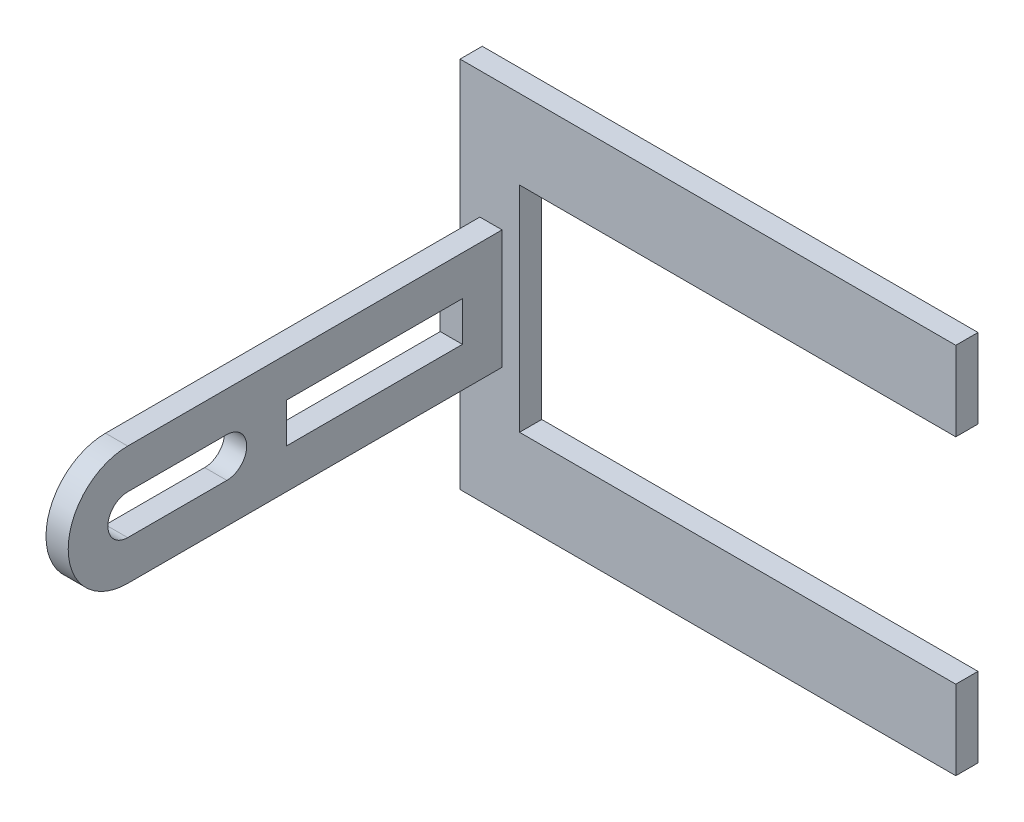
ISO-10303-21;
HEADER;
FILE_DESCRIPTION(('STEP AP214'),'2;1');
FILE_NAME('part.step','',(''),(''),'','','');
FILE_SCHEMA(('AUTOMOTIVE_DESIGN { 1 0 10303 214 1 1 1 1 }'));
ENDSEC;
DATA;
#1=APPLICATION_CONTEXT('core data for automotive mechanical design processes');
#2=APPLICATION_PROTOCOL_DEFINITION('international standard','automotive_design',2000,#1);
#3=PRODUCT_CONTEXT('',#1,'mechanical');
#4=PRODUCT('Part','Part','',(#3));
#5=PRODUCT_RELATED_PRODUCT_CATEGORY('part','',(#4));
#6=PRODUCT_DEFINITION_FORMATION('','',#4);
#7=PRODUCT_DEFINITION_CONTEXT('part definition',#1,'design');
#8=PRODUCT_DEFINITION('design','',#6,#7);
#9=PRODUCT_DEFINITION_SHAPE('','',#8);
#10=(LENGTH_UNIT() NAMED_UNIT(*) SI_UNIT(.MILLI.,.METRE.));
#11=(NAMED_UNIT(*) PLANE_ANGLE_UNIT() SI_UNIT($,.RADIAN.));
#12=(NAMED_UNIT(*) SI_UNIT($,.STERADIAN.) SOLID_ANGLE_UNIT());
#13=UNCERTAINTY_MEASURE_WITH_UNIT(LENGTH_MEASURE(1.E-05),#10,'distance_accuracy_value','');
#14=(GEOMETRIC_REPRESENTATION_CONTEXT(3) GLOBAL_UNCERTAINTY_ASSIGNED_CONTEXT((#13)) GLOBAL_UNIT_ASSIGNED_CONTEXT((#10,
#11,#12)) REPRESENTATION_CONTEXT('',''));
#15=CARTESIAN_POINT('',(0.,0.,0.));
#16=DIRECTION('',(0.,0.,1.));
#17=DIRECTION('',(1.,0.,0.));
#18=AXIS2_PLACEMENT_3D('',#15,#16,#17);
#19=CARTESIAN_POINT('',(0.,0.,2.8));
#20=DIRECTION('',(0.,0.,1.));
#21=DIRECTION('',(1.,0.,0.));
#22=AXIS2_PLACEMENT_3D('',#19,#20,#21);
#23=PLANE('',#22);
#24=DIRECTION('',(1.,0.,0.));
#25=VECTOR('',#24,1.);
#26=CARTESIAN_POINT('',(-25.,13.5,2.8));
#27=LINE('',#26,#25);
#28=CARTESIAN_POINT('',(-25.,13.5,2.8));
#29=VERTEX_POINT('',#28);
#30=CARTESIAN_POINT('',(30.,13.5,2.8));
#31=VERTEX_POINT('',#30);
#32=EDGE_CURVE('E157',#29,#31,#27,.T.);
#33=ORIENTED_EDGE('',*,*,#32,.T.);
#34=DIRECTION('',(0.,1.,0.));
#35=VECTOR('',#34,1.);
#36=CARTESIAN_POINT('',(30.,13.5,2.8));
#37=LINE('',#36,#35);
#38=CARTESIAN_POINT('',(30.,23.5,2.8));
#39=VERTEX_POINT('',#38);
#40=EDGE_CURVE('E98',#31,#39,#37,.T.);
#41=ORIENTED_EDGE('',*,*,#40,.T.);
#42=DIRECTION('',(-1.,0.,0.));
#43=VECTOR('',#42,1.);
#44=CARTESIAN_POINT('',(30.,23.5,2.8));
#45=LINE('',#44,#43);
#46=CARTESIAN_POINT('',(-32.5,23.5,2.8));
#47=VERTEX_POINT('',#46);
#48=EDGE_CURVE('E172',#39,#47,#45,.T.);
#49=ORIENTED_EDGE('',*,*,#48,.T.);
#50=DIRECTION('',(0.,-1.,0.));
#51=VECTOR('',#50,1.);
#52=CARTESIAN_POINT('',(-32.5,23.5,2.8));
#53=LINE('',#52,#51);
#54=CARTESIAN_POINT('',(-32.5,-23.5,2.8));
#55=VERTEX_POINT('',#54);
#56=EDGE_CURVE('E184',#47,#55,#53,.T.);
#57=ORIENTED_EDGE('',*,*,#56,.T.);
#58=DIRECTION('',(1.,0.,0.));
#59=VECTOR('',#58,1.);
#60=CARTESIAN_POINT('',(-32.5,-23.5,2.8));
#61=LINE('',#60,#59);
#62=CARTESIAN_POINT('',(30.,-23.5,2.8));
#63=VERTEX_POINT('',#62);
#64=EDGE_CURVE('E120',#55,#63,#61,.T.);
#65=ORIENTED_EDGE('',*,*,#64,.T.);
#66=DIRECTION('',(0.,1.,0.));
#67=VECTOR('',#66,1.);
#68=CARTESIAN_POINT('',(30.,-23.5,2.8));
#69=LINE('',#68,#67);
#70=CARTESIAN_POINT('',(30.,-13.5,2.8));
#71=VERTEX_POINT('',#70);
#72=EDGE_CURVE('E113',#63,#71,#69,.T.);
#73=ORIENTED_EDGE('',*,*,#72,.T.);
#74=DIRECTION('',(-1.,0.,0.));
#75=VECTOR('',#74,1.);
#76=CARTESIAN_POINT('',(30.,-13.5,2.8));
#77=LINE('',#76,#75);
#78=CARTESIAN_POINT('',(-25.,-13.5,2.8));
#79=VERTEX_POINT('',#78);
#80=EDGE_CURVE('E117',#71,#79,#77,.T.);
#81=ORIENTED_EDGE('',*,*,#80,.T.);
#82=DIRECTION('',(0.,1.,0.));
#83=VECTOR('',#82,1.);
#84=CARTESIAN_POINT('',(-25.,-13.5,2.8));
#85=LINE('',#84,#83);
#86=EDGE_CURVE('E57',#79,#29,#85,.T.);
#87=ORIENTED_EDGE('',*,*,#86,.T.);
#88=EDGE_LOOP('',(#33,#41,#49,#57,#65,#73,#81,#87));
#89=FACE_BOUND('',#88,.T.);
#90=DIRECTION('',(0.,1.,0.));
#91=VECTOR('',#90,1.);
#92=CARTESIAN_POINT('',(-27.2,-7.5,2.8));
#93=LINE('',#92,#91);
#94=CARTESIAN_POINT('',(-27.2,-7.5,2.8));
#95=VERTEX_POINT('',#94);
#96=CARTESIAN_POINT('',(-27.2,7.5,2.8));
#97=VERTEX_POINT('',#96);
#98=EDGE_CURVE('E218',#95,#97,#93,.T.);
#99=ORIENTED_EDGE('',*,*,#98,.F.);
#100=DIRECTION('',(-1.,0.,0.));
#101=VECTOR('',#100,1.);
#102=CARTESIAN_POINT('',(-27.2,-7.5,2.8));
#103=LINE('',#102,#101);
#104=CARTESIAN_POINT('',(-30.,-7.5,2.8));
#105=VERTEX_POINT('',#104);
#106=EDGE_CURVE('E145',#95,#105,#103,.T.);
#107=ORIENTED_EDGE('',*,*,#106,.T.);
#108=DIRECTION('',(0.,1.,0.));
#109=VECTOR('',#108,1.);
#110=CARTESIAN_POINT('',(-30.,-7.5,2.8));
#111=LINE('',#110,#109);
#112=CARTESIAN_POINT('',(-30.,7.5,2.8));
#113=VERTEX_POINT('',#112);
#114=EDGE_CURVE('E208',#105,#113,#111,.T.);
#115=ORIENTED_EDGE('',*,*,#114,.T.);
#116=DIRECTION('',(-1.,0.,0.));
#117=VECTOR('',#116,1.);
#118=CARTESIAN_POINT('',(-27.2,7.5,2.8));
#119=LINE('',#118,#117);
#120=EDGE_CURVE('E192',#97,#113,#119,.T.);
#121=ORIENTED_EDGE('',*,*,#120,.F.);
#122=EDGE_LOOP('',(#99,#107,#115,#121));
#123=FACE_BOUND('',#122,.T.);
#124=ADVANCED_FACE('F33',(#89,#123),#23,.T.);
#125=CARTESIAN_POINT('',(-25.,13.5,2.8));
#126=DIRECTION('',(0.,1.,0.));
#127=DIRECTION('',(-1.,0.,0.));
#128=AXIS2_PLACEMENT_3D('',#125,#126,#127);
#129=PLANE('',#128);
#130=DIRECTION('',(1.,0.,0.));
#131=VECTOR('',#130,1.);
#132=CARTESIAN_POINT('',(-25.,13.5,0.));
#133=LINE('',#132,#131);
#134=CARTESIAN_POINT('',(-25.,13.5,0.));
#135=VERTEX_POINT('',#134);
#136=CARTESIAN_POINT('',(30.,13.5,0.));
#137=VERTEX_POINT('',#136);
#138=EDGE_CURVE('E141',#135,#137,#133,.T.);
#139=ORIENTED_EDGE('',*,*,#138,.T.);
#140=DIRECTION('',(0.,0.,-1.));
#141=VECTOR('',#140,1.);
#142=CARTESIAN_POINT('',(30.,13.5,2.8));
#143=LINE('',#142,#141);
#144=EDGE_CURVE('E11',#31,#137,#143,.T.);
#145=ORIENTED_EDGE('',*,*,#144,.F.);
#146=ORIENTED_EDGE('',*,*,#32,.F.);
#147=DIRECTION('',(0.,0.,-1.));
#148=VECTOR('',#147,1.);
#149=CARTESIAN_POINT('',(-25.,13.5,2.8));
#150=LINE('',#149,#148);
#151=EDGE_CURVE('E137',#29,#135,#150,.T.);
#152=ORIENTED_EDGE('',*,*,#151,.T.);
#153=EDGE_LOOP('',(#139,#145,#146,#152));
#154=FACE_BOUND('',#153,.T.);
#155=ADVANCED_FACE('F35',(#154),#129,.F.);
#156=CARTESIAN_POINT('',(30.,13.5,2.8));
#157=DIRECTION('',(-1.,0.,0.));
#158=DIRECTION('',(0.,-1.,0.));
#159=AXIS2_PLACEMENT_3D('',#156,#157,#158);
#160=PLANE('',#159);
#161=DIRECTION('',(0.,1.,0.));
#162=VECTOR('',#161,1.);
#163=CARTESIAN_POINT('',(30.,13.5,0.));
#164=LINE('',#163,#162);
#165=CARTESIAN_POINT('',(30.,23.5,0.));
#166=VERTEX_POINT('',#165);
#167=EDGE_CURVE('E144',#137,#166,#164,.T.);
#168=ORIENTED_EDGE('',*,*,#167,.T.);
#169=DIRECTION('',(0.,0.,-1.));
#170=VECTOR('',#169,1.);
#171=CARTESIAN_POINT('',(30.,23.5,2.8));
#172=LINE('',#171,#170);
#173=EDGE_CURVE('E41',#39,#166,#172,.T.);
#174=ORIENTED_EDGE('',*,*,#173,.F.);
#175=ORIENTED_EDGE('',*,*,#40,.F.);
#176=ORIENTED_EDGE('',*,*,#144,.T.);
#177=EDGE_LOOP('',(#168,#174,#175,#176));
#178=FACE_BOUND('',#177,.T.);
#179=ADVANCED_FACE('F383',(#178),#160,.F.);
#180=CARTESIAN_POINT('',(30.,23.5,2.8));
#181=DIRECTION('',(0.,-1.,0.));
#182=DIRECTION('',(1.,0.,0.));
#183=AXIS2_PLACEMENT_3D('',#180,#181,#182);
#184=PLANE('',#183);
#185=DIRECTION('',(-1.,0.,0.));
#186=VECTOR('',#185,1.);
#187=CARTESIAN_POINT('',(30.,23.5,0.));
#188=LINE('',#187,#186);
#189=CARTESIAN_POINT('',(-32.5,23.5,0.));
#190=VERTEX_POINT('',#189);
#191=EDGE_CURVE('E147',#166,#190,#188,.T.);
#192=ORIENTED_EDGE('',*,*,#191,.T.);
#193=DIRECTION('',(0.,0.,-1.));
#194=VECTOR('',#193,1.);
#195=CARTESIAN_POINT('',(-32.5,23.5,2.8));
#196=LINE('',#195,#194);
#197=EDGE_CURVE('E164',#47,#190,#196,.T.);
#198=ORIENTED_EDGE('',*,*,#197,.F.);
#199=ORIENTED_EDGE('',*,*,#48,.F.);
#200=ORIENTED_EDGE('',*,*,#173,.T.);
#201=EDGE_LOOP('',(#192,#198,#199,#200));
#202=FACE_BOUND('',#201,.T.);
#203=ADVANCED_FACE('F170',(#202),#184,.F.);
#204=CARTESIAN_POINT('',(-32.5,23.5,2.8));
#205=DIRECTION('',(1.,0.,0.));
#206=DIRECTION('',(0.,1.,0.));
#207=AXIS2_PLACEMENT_3D('',#204,#205,#206);
#208=PLANE('',#207);
#209=DIRECTION('',(0.,-1.,0.));
#210=VECTOR('',#209,1.);
#211=CARTESIAN_POINT('',(-32.5,23.5,0.));
#212=LINE('',#211,#210);
#213=CARTESIAN_POINT('',(-32.5,-23.5,0.));
#214=VERTEX_POINT('',#213);
#215=EDGE_CURVE('E149',#190,#214,#212,.T.);
#216=ORIENTED_EDGE('',*,*,#215,.T.);
#217=DIRECTION('',(0.,0.,-1.));
#218=VECTOR('',#217,1.);
#219=CARTESIAN_POINT('',(-32.5,-23.5,2.8));
#220=LINE('',#219,#218);
#221=EDGE_CURVE('E161',#55,#214,#220,.T.);
#222=ORIENTED_EDGE('',*,*,#221,.F.);
#223=ORIENTED_EDGE('',*,*,#56,.F.);
#224=ORIENTED_EDGE('',*,*,#197,.T.);
#225=EDGE_LOOP('',(#216,#222,#223,#224));
#226=FACE_BOUND('',#225,.T.);
#227=ADVANCED_FACE('F180',(#226),#208,.F.);
#228=CARTESIAN_POINT('',(-32.5,-23.5,2.8));
#229=DIRECTION('',(0.,1.,0.));
#230=DIRECTION('',(0.,0.,1.));
#231=AXIS2_PLACEMENT_3D('',#228,#229,#230);
#232=PLANE('',#231);
#233=DIRECTION('',(1.,0.,0.));
#234=VECTOR('',#233,1.);
#235=CARTESIAN_POINT('',(-32.5,-23.5,0.));
#236=LINE('',#235,#234);
#237=CARTESIAN_POINT('',(30.,-23.5,0.));
#238=VERTEX_POINT('',#237);
#239=EDGE_CURVE('E151',#214,#238,#236,.T.);
#240=ORIENTED_EDGE('',*,*,#239,.T.);
#241=DIRECTION('',(0.,0.,-1.));
#242=VECTOR('',#241,1.);
#243=CARTESIAN_POINT('',(30.,-23.5,2.8));
#244=LINE('',#243,#242);
#245=EDGE_CURVE('E132',#63,#238,#244,.T.);
#246=ORIENTED_EDGE('',*,*,#245,.F.);
#247=ORIENTED_EDGE('',*,*,#64,.F.);
#248=ORIENTED_EDGE('',*,*,#221,.T.);
#249=EDGE_LOOP('',(#240,#246,#247,#248));
#250=FACE_BOUND('',#249,.T.);
#251=ADVANCED_FACE('F183',(#250),#232,.F.);
#252=CARTESIAN_POINT('',(30.,-23.5,2.8));
#253=DIRECTION('',(-1.,0.,0.));
#254=DIRECTION('',(0.,0.,1.));
#255=AXIS2_PLACEMENT_3D('',#252,#253,#254);
#256=PLANE('',#255);
#257=DIRECTION('',(0.,1.,0.));
#258=VECTOR('',#257,1.);
#259=CARTESIAN_POINT('',(30.,-23.5,0.));
#260=LINE('',#259,#258);
#261=CARTESIAN_POINT('',(30.,-13.5,0.));
#262=VERTEX_POINT('',#261);
#263=EDGE_CURVE('E129',#238,#262,#260,.T.);
#264=ORIENTED_EDGE('',*,*,#263,.T.);
#265=DIRECTION('',(0.,0.,-1.));
#266=VECTOR('',#265,1.);
#267=CARTESIAN_POINT('',(30.,-13.5,2.8));
#268=LINE('',#267,#266);
#269=EDGE_CURVE('E126',#71,#262,#268,.T.);
#270=ORIENTED_EDGE('',*,*,#269,.F.);
#271=ORIENTED_EDGE('',*,*,#72,.F.);
#272=ORIENTED_EDGE('',*,*,#245,.T.);
#273=EDGE_LOOP('',(#264,#270,#271,#272));
#274=FACE_BOUND('',#273,.T.);
#275=ADVANCED_FACE('F127',(#274),#256,.F.);
#276=CARTESIAN_POINT('',(30.,-13.5,2.8));
#277=DIRECTION('',(0.,-1.,0.));
#278=DIRECTION('',(1.,0.,0.));
#279=AXIS2_PLACEMENT_3D('',#276,#277,#278);
#280=PLANE('',#279);
#281=DIRECTION('',(-1.,0.,0.));
#282=VECTOR('',#281,1.);
#283=CARTESIAN_POINT('',(30.,-13.5,0.));
#284=LINE('',#283,#282);
#285=CARTESIAN_POINT('',(-25.,-13.5,0.));
#286=VERTEX_POINT('',#285);
#287=EDGE_CURVE('E154',#262,#286,#284,.T.);
#288=ORIENTED_EDGE('',*,*,#287,.T.);
#289=DIRECTION('',(0.,0.,-1.));
#290=VECTOR('',#289,1.);
#291=CARTESIAN_POINT('',(-25.,-13.5,2.8));
#292=LINE('',#291,#290);
#293=EDGE_CURVE('E133',#79,#286,#292,.T.);
#294=ORIENTED_EDGE('',*,*,#293,.F.);
#295=ORIENTED_EDGE('',*,*,#80,.F.);
#296=ORIENTED_EDGE('',*,*,#269,.T.);
#297=EDGE_LOOP('',(#288,#294,#295,#296));
#298=FACE_BOUND('',#297,.T.);
#299=ADVANCED_FACE('F135',(#298),#280,.F.);
#300=CARTESIAN_POINT('',(-25.,-13.5,2.8));
#301=DIRECTION('',(-1.,0.,0.));
#302=DIRECTION('',(0.,0.,1.));
#303=AXIS2_PLACEMENT_3D('',#300,#301,#302);
#304=PLANE('',#303);
#305=DIRECTION('',(0.,1.,0.));
#306=VECTOR('',#305,1.);
#307=CARTESIAN_POINT('',(-25.,-13.5,0.));
#308=LINE('',#307,#306);
#309=EDGE_CURVE('E90',#286,#135,#308,.T.);
#310=ORIENTED_EDGE('',*,*,#309,.T.);
#311=ORIENTED_EDGE('',*,*,#151,.F.);
#312=ORIENTED_EDGE('',*,*,#86,.F.);
#313=ORIENTED_EDGE('',*,*,#293,.T.);
#314=EDGE_LOOP('',(#310,#311,#312,#313));
#315=FACE_BOUND('',#314,.T.);
#316=ADVANCED_FACE('F389',(#315),#304,.F.);
#317=CARTESIAN_POINT('',(0.,0.,0.));
#318=DIRECTION('',(0.,0.,1.));
#319=DIRECTION('',(1.,0.,0.));
#320=AXIS2_PLACEMENT_3D('',#317,#318,#319);
#321=PLANE('',#320);
#322=ORIENTED_EDGE('',*,*,#138,.F.);
#323=ORIENTED_EDGE('',*,*,#309,.F.);
#324=ORIENTED_EDGE('',*,*,#287,.F.);
#325=ORIENTED_EDGE('',*,*,#263,.F.);
#326=ORIENTED_EDGE('',*,*,#239,.F.);
#327=ORIENTED_EDGE('',*,*,#215,.F.);
#328=ORIENTED_EDGE('',*,*,#191,.F.);
#329=ORIENTED_EDGE('',*,*,#167,.F.);
#330=EDGE_LOOP('',(#322,#323,#324,#325,#326,#327,#328,#329));
#331=FACE_BOUND('',#330,.T.);
#332=ADVANCED_FACE('F176',(#331),#321,.F.);
#333=CARTESIAN_POINT('',(-27.2,0.,50.));
#334=DIRECTION('',(1.,0.,0.));
#335=DIRECTION('',(0.,0.,-1.));
#336=AXIS2_PLACEMENT_3D('',#333,#334,#335);
#337=PLANE('',#336);
#338=DIRECTION('',(0.,0.,-1.));
#339=VECTOR('',#338,1.);
#340=CARTESIAN_POINT('',(-27.2,-7.5,50.));
#341=LINE('',#340,#339);
#342=CARTESIAN_POINT('',(-27.2,-7.5,50.));
#343=VERTEX_POINT('',#342);
#344=EDGE_CURVE('E204',#343,#95,#341,.T.);
#345=ORIENTED_EDGE('',*,*,#344,.T.);
#346=ORIENTED_EDGE('',*,*,#98,.T.);
#347=DIRECTION('',(0.,0.,1.));
#348=VECTOR('',#347,1.);
#349=CARTESIAN_POINT('',(-27.2,7.5,2.8));
#350=LINE('',#349,#348);
#351=CARTESIAN_POINT('',(-27.2,7.5,50.));
#352=VERTEX_POINT('',#351);
#353=EDGE_CURVE('E48',#97,#352,#350,.T.);
#354=ORIENTED_EDGE('',*,*,#353,.T.);
#355=CARTESIAN_POINT('',(-27.2,0.,50.));
#356=DIRECTION('',(1.,0.,0.));
#357=DIRECTION('',(0.,0.,-1.));
#358=AXIS2_PLACEMENT_3D('',#355,#356,#357);
#359=CIRCLE('',#358,7.5);
#360=EDGE_CURVE('E200',#352,#343,#359,.T.);
#361=ORIENTED_EDGE('',*,*,#360,.T.);
#362=EDGE_LOOP('',(#345,#346,#354,#361));
#363=FACE_BOUND('',#362,.T.);
#364=DIRECTION('',(0.,0.,-1.));
#365=VECTOR('',#364,1.);
#366=CARTESIAN_POINT('',(-27.2,-2.5,50.));
#367=LINE('',#366,#365);
#368=CARTESIAN_POINT('',(-27.2,-2.5,50.));
#369=VERTEX_POINT('',#368);
#370=CARTESIAN_POINT('',(-27.2,-2.5,37.5));
#371=VERTEX_POINT('',#370);
#372=EDGE_CURVE('E253',#369,#371,#367,.T.);
#373=ORIENTED_EDGE('',*,*,#372,.F.);
#374=CARTESIAN_POINT('',(-27.2,0.,50.));
#375=DIRECTION('',(1.,0.,0.));
#376=DIRECTION('',(0.,0.,-1.));
#377=AXIS2_PLACEMENT_3D('',#374,#375,#376);
#378=CIRCLE('',#377,2.5);
#379=CARTESIAN_POINT('',(-27.2,2.5,50.));
#380=VERTEX_POINT('',#379);
#381=EDGE_CURVE('E237',#380,#369,#378,.T.);
#382=ORIENTED_EDGE('',*,*,#381,.F.);
#383=DIRECTION('',(0.,0.,1.));
#384=VECTOR('',#383,1.);
#385=CARTESIAN_POINT('',(-27.2,2.5,37.5));
#386=LINE('',#385,#384);
#387=CARTESIAN_POINT('',(-27.2,2.5,37.5));
#388=VERTEX_POINT('',#387);
#389=EDGE_CURVE('E233',#388,#380,#386,.T.);
#390=ORIENTED_EDGE('',*,*,#389,.F.);
#391=CARTESIAN_POINT('',(-27.2,0.,37.5));
#392=DIRECTION('',(1.,0.,0.));
#393=DIRECTION('',(0.,0.,1.));
#394=AXIS2_PLACEMENT_3D('',#391,#392,#393);
#395=CIRCLE('',#394,2.5);
#396=EDGE_CURVE('E250',#371,#388,#395,.T.);
#397=ORIENTED_EDGE('',*,*,#396,.F.);
#398=EDGE_LOOP('',(#373,#382,#390,#397));
#399=FACE_BOUND('',#398,.T.);
#400=DIRECTION('',(0.,1.,0.));
#401=VECTOR('',#400,1.);
#402=CARTESIAN_POINT('',(-27.2,-2.5,7.8));
#403=LINE('',#402,#401);
#404=CARTESIAN_POINT('',(-27.2,-2.5,7.8));
#405=VERTEX_POINT('',#404);
#406=CARTESIAN_POINT('',(-27.2,2.5,7.8));
#407=VERTEX_POINT('',#406);
#408=EDGE_CURVE('E288',#405,#407,#403,.T.);
#409=ORIENTED_EDGE('',*,*,#408,.F.);
#410=DIRECTION('',(0.,0.,-1.));
#411=VECTOR('',#410,1.);
#412=CARTESIAN_POINT('',(-27.2,-2.5,30.));
#413=LINE('',#412,#411);
#414=CARTESIAN_POINT('',(-27.2,-2.5,30.));
#415=VERTEX_POINT('',#414);
#416=EDGE_CURVE('E273',#415,#405,#413,.T.);
#417=ORIENTED_EDGE('',*,*,#416,.F.);
#418=DIRECTION('',(0.,-1.,0.));
#419=VECTOR('',#418,1.);
#420=CARTESIAN_POINT('',(-27.2,2.5,30.));
#421=LINE('',#420,#419);
#422=CARTESIAN_POINT('',(-27.2,2.5,30.));
#423=VERTEX_POINT('',#422);
#424=EDGE_CURVE('E269',#423,#415,#421,.T.);
#425=ORIENTED_EDGE('',*,*,#424,.F.);
#426=DIRECTION('',(0.,0.,1.));
#427=VECTOR('',#426,1.);
#428=CARTESIAN_POINT('',(-27.2,2.5,7.8));
#429=LINE('',#428,#427);
#430=EDGE_CURVE('E285',#407,#423,#429,.T.);
#431=ORIENTED_EDGE('',*,*,#430,.F.);
#432=EDGE_LOOP('',(#409,#417,#425,#431));
#433=FACE_BOUND('',#432,.T.);
#434=ADVANCED_FACE('F312',(#363,#399,#433),#337,.T.);
#435=CARTESIAN_POINT('',(-30.,0.,50.));
#436=DIRECTION('',(1.,0.,0.));
#437=DIRECTION('',(0.,0.,-1.));
#438=AXIS2_PLACEMENT_3D('',#435,#436,#437);
#439=PLANE('',#438);
#440=CARTESIAN_POINT('',(-30.,0.,50.));
#441=DIRECTION('',(1.,0.,0.));
#442=DIRECTION('',(0.,0.,-1.));
#443=AXIS2_PLACEMENT_3D('',#440,#441,#442);
#444=CIRCLE('',#443,2.5);
#445=CARTESIAN_POINT('',(-30.,2.5,50.));
#446=VERTEX_POINT('',#445);
#447=CARTESIAN_POINT('',(-30.,-2.5,50.));
#448=VERTEX_POINT('',#447);
#449=EDGE_CURVE('E244',#446,#448,#444,.T.);
#450=ORIENTED_EDGE('',*,*,#449,.T.);
#451=DIRECTION('',(0.,0.,-1.));
#452=VECTOR('',#451,1.);
#453=CARTESIAN_POINT('',(-30.,-2.5,50.));
#454=LINE('',#453,#452);
#455=CARTESIAN_POINT('',(-30.,-2.5,37.5));
#456=VERTEX_POINT('',#455);
#457=EDGE_CURVE('E241',#448,#456,#454,.T.);
#458=ORIENTED_EDGE('',*,*,#457,.T.);
#459=CARTESIAN_POINT('',(-30.,0.,37.5));
#460=DIRECTION('',(1.,0.,0.));
#461=DIRECTION('',(0.,0.,1.));
#462=AXIS2_PLACEMENT_3D('',#459,#460,#461);
#463=CIRCLE('',#462,2.5);
#464=CARTESIAN_POINT('',(-30.,2.5,37.5));
#465=VERTEX_POINT('',#464);
#466=EDGE_CURVE('E238',#456,#465,#463,.T.);
#467=ORIENTED_EDGE('',*,*,#466,.T.);
#468=DIRECTION('',(0.,0.,1.));
#469=VECTOR('',#468,1.);
#470=CARTESIAN_POINT('',(-30.,2.5,37.5));
#471=LINE('',#470,#469);
#472=EDGE_CURVE('E234',#465,#446,#471,.T.);
#473=ORIENTED_EDGE('',*,*,#472,.T.);
#474=EDGE_LOOP('',(#450,#458,#467,#473));
#475=FACE_BOUND('',#474,.T.);
#476=DIRECTION('',(0.,0.,-1.));
#477=VECTOR('',#476,1.);
#478=CARTESIAN_POINT('',(-30.,-7.5,50.));
#479=LINE('',#478,#477);
#480=CARTESIAN_POINT('',(-30.,-7.5,50.));
#481=VERTEX_POINT('',#480);
#482=EDGE_CURVE('E211',#481,#105,#479,.T.);
#483=ORIENTED_EDGE('',*,*,#482,.F.);
#484=CARTESIAN_POINT('',(-30.,0.,50.));
#485=DIRECTION('',(1.,0.,0.));
#486=DIRECTION('',(0.,0.,-1.));
#487=AXIS2_PLACEMENT_3D('',#484,#485,#486);
#488=CIRCLE('',#487,7.5);
#489=CARTESIAN_POINT('',(-30.,7.5,50.));
#490=VERTEX_POINT('',#489);
#491=EDGE_CURVE('E201',#490,#481,#488,.T.);
#492=ORIENTED_EDGE('',*,*,#491,.F.);
#493=DIRECTION('',(0.,0.,1.));
#494=VECTOR('',#493,1.);
#495=CARTESIAN_POINT('',(-30.,7.5,2.8));
#496=LINE('',#495,#494);
#497=EDGE_CURVE('E205',#113,#490,#496,.T.);
#498=ORIENTED_EDGE('',*,*,#497,.F.);
#499=ORIENTED_EDGE('',*,*,#114,.F.);
#500=EDGE_LOOP('',(#483,#492,#498,#499));
#501=FACE_BOUND('',#500,.T.);
#502=DIRECTION('',(0.,0.,-1.));
#503=VECTOR('',#502,1.);
#504=CARTESIAN_POINT('',(-30.,-2.5,30.));
#505=LINE('',#504,#503);
#506=CARTESIAN_POINT('',(-30.,-2.5,30.));
#507=VERTEX_POINT('',#506);
#508=CARTESIAN_POINT('',(-30.,-2.5,7.8));
#509=VERTEX_POINT('',#508);
#510=EDGE_CURVE('E280',#507,#509,#505,.T.);
#511=ORIENTED_EDGE('',*,*,#510,.T.);
#512=DIRECTION('',(0.,1.,0.));
#513=VECTOR('',#512,1.);
#514=CARTESIAN_POINT('',(-30.,-2.5,7.8));
#515=LINE('',#514,#513);
#516=CARTESIAN_POINT('',(-30.,2.5,7.8));
#517=VERTEX_POINT('',#516);
#518=EDGE_CURVE('E277',#509,#517,#515,.T.);
#519=ORIENTED_EDGE('',*,*,#518,.T.);
#520=DIRECTION('',(0.,0.,1.));
#521=VECTOR('',#520,1.);
#522=CARTESIAN_POINT('',(-30.,2.5,7.8));
#523=LINE('',#522,#521);
#524=CARTESIAN_POINT('',(-30.,2.5,30.));
#525=VERTEX_POINT('',#524);
#526=EDGE_CURVE('E274',#517,#525,#523,.T.);
#527=ORIENTED_EDGE('',*,*,#526,.T.);
#528=DIRECTION('',(0.,-1.,0.));
#529=VECTOR('',#528,1.);
#530=CARTESIAN_POINT('',(-30.,2.5,30.));
#531=LINE('',#530,#529);
#532=EDGE_CURVE('E270',#525,#507,#531,.T.);
#533=ORIENTED_EDGE('',*,*,#532,.T.);
#534=EDGE_LOOP('',(#511,#519,#527,#533));
#535=FACE_BOUND('',#534,.T.);
#536=ADVANCED_FACE('F362',(#475,#501,#535),#439,.F.);
#537=CARTESIAN_POINT('',(-27.2,-7.5,50.));
#538=DIRECTION('',(0.,1.,0.));
#539=DIRECTION('',(0.,0.,1.));
#540=AXIS2_PLACEMENT_3D('',#537,#538,#539);
#541=PLANE('',#540);
#542=ORIENTED_EDGE('',*,*,#482,.T.);
#543=ORIENTED_EDGE('',*,*,#106,.F.);
#544=ORIENTED_EDGE('',*,*,#344,.F.);
#545=DIRECTION('',(-1.,0.,0.));
#546=VECTOR('',#545,1.);
#547=CARTESIAN_POINT('',(-27.2,-7.5,50.));
#548=LINE('',#547,#546);
#549=EDGE_CURVE('E197',#343,#481,#548,.T.);
#550=ORIENTED_EDGE('',*,*,#549,.T.);
#551=EDGE_LOOP('',(#542,#543,#544,#550));
#552=FACE_BOUND('',#551,.T.);
#553=ADVANCED_FACE('F364',(#552),#541,.F.);
#554=CARTESIAN_POINT('',(-27.2,7.5,2.8));
#555=DIRECTION('',(0.,-1.,0.));
#556=DIRECTION('',(0.,0.,-1.));
#557=AXIS2_PLACEMENT_3D('',#554,#555,#556);
#558=PLANE('',#557);
#559=ORIENTED_EDGE('',*,*,#497,.T.);
#560=DIRECTION('',(-1.,0.,0.));
#561=VECTOR('',#560,1.);
#562=CARTESIAN_POINT('',(-27.2,7.5,50.));
#563=LINE('',#562,#561);
#564=EDGE_CURVE('E194',#352,#490,#563,.T.);
#565=ORIENTED_EDGE('',*,*,#564,.F.);
#566=ORIENTED_EDGE('',*,*,#353,.F.);
#567=ORIENTED_EDGE('',*,*,#120,.T.);
#568=EDGE_LOOP('',(#559,#565,#566,#567));
#569=FACE_BOUND('',#568,.T.);
#570=ADVANCED_FACE('F371',(#569),#558,.F.);
#571=CARTESIAN_POINT('',(-27.2,0.,50.));
#572=DIRECTION('',(-1.,0.,0.));
#573=DIRECTION('',(0.,0.,1.));
#574=AXIS2_PLACEMENT_3D('',#571,#572,#573);
#575=CYLINDRICAL_SURFACE('',#574,7.5);
#576=ORIENTED_EDGE('',*,*,#491,.T.);
#577=ORIENTED_EDGE('',*,*,#549,.F.);
#578=ORIENTED_EDGE('',*,*,#360,.F.);
#579=ORIENTED_EDGE('',*,*,#564,.T.);
#580=EDGE_LOOP('',(#576,#577,#578,#579));
#581=FACE_BOUND('',#580,.T.);
#582=ADVANCED_FACE('F461',(#581),#575,.T.);
#583=CARTESIAN_POINT('',(-27.2,0.,50.));
#584=DIRECTION('',(-1.,0.,0.));
#585=DIRECTION('',(0.,0.,1.));
#586=AXIS2_PLACEMENT_3D('',#583,#584,#585);
#587=CYLINDRICAL_SURFACE('',#586,2.5);
#588=ORIENTED_EDGE('',*,*,#449,.F.);
#589=DIRECTION('',(-1.,0.,0.));
#590=VECTOR('',#589,1.);
#591=CARTESIAN_POINT('',(-27.2,2.5,50.));
#592=LINE('',#591,#590);
#593=EDGE_CURVE('E230',#380,#446,#592,.T.);
#594=ORIENTED_EDGE('',*,*,#593,.F.);
#595=ORIENTED_EDGE('',*,*,#381,.T.);
#596=DIRECTION('',(-1.,0.,0.));
#597=VECTOR('',#596,1.);
#598=CARTESIAN_POINT('',(-27.2,-2.5,50.));
#599=LINE('',#598,#597);
#600=EDGE_CURVE('E214',#369,#448,#599,.T.);
#601=ORIENTED_EDGE('',*,*,#600,.T.);
#602=EDGE_LOOP('',(#588,#594,#595,#601));
#603=FACE_BOUND('',#602,.T.);
#604=ADVANCED_FACE('F469',(#603),#587,.F.);
#605=CARTESIAN_POINT('',(-27.2,-2.5,50.));
#606=DIRECTION('',(0.,1.,0.));
#607=DIRECTION('',(0.,0.,1.));
#608=AXIS2_PLACEMENT_3D('',#605,#606,#607);
#609=PLANE('',#608);
#610=ORIENTED_EDGE('',*,*,#457,.F.);
#611=ORIENTED_EDGE('',*,*,#600,.F.);
#612=ORIENTED_EDGE('',*,*,#372,.T.);
#613=DIRECTION('',(-1.,0.,0.));
#614=VECTOR('',#613,1.);
#615=CARTESIAN_POINT('',(-27.2,-2.5,37.5));
#616=LINE('',#615,#614);
#617=EDGE_CURVE('E224',#371,#456,#616,.T.);
#618=ORIENTED_EDGE('',*,*,#617,.T.);
#619=EDGE_LOOP('',(#610,#611,#612,#618));
#620=FACE_BOUND('',#619,.T.);
#621=ADVANCED_FACE('F478',(#620),#609,.T.);
#622=CARTESIAN_POINT('',(-27.2,0.,37.5));
#623=DIRECTION('',(-1.,0.,0.));
#624=DIRECTION('',(0.,0.,1.));
#625=AXIS2_PLACEMENT_3D('',#622,#623,#624);
#626=CYLINDRICAL_SURFACE('',#625,2.5);
#627=ORIENTED_EDGE('',*,*,#466,.F.);
#628=ORIENTED_EDGE('',*,*,#617,.F.);
#629=ORIENTED_EDGE('',*,*,#396,.T.);
#630=DIRECTION('',(-1.,0.,0.));
#631=VECTOR('',#630,1.);
#632=CARTESIAN_POINT('',(-27.2,2.5,37.5));
#633=LINE('',#632,#631);
#634=EDGE_CURVE('E227',#388,#465,#633,.T.);
#635=ORIENTED_EDGE('',*,*,#634,.T.);
#636=EDGE_LOOP('',(#627,#628,#629,#635));
#637=FACE_BOUND('',#636,.T.);
#638=ADVANCED_FACE('F488',(#637),#626,.F.);
#639=CARTESIAN_POINT('',(-27.2,2.5,37.5));
#640=DIRECTION('',(0.,-1.,0.));
#641=DIRECTION('',(0.,0.,-1.));
#642=AXIS2_PLACEMENT_3D('',#639,#640,#641);
#643=PLANE('',#642);
#644=ORIENTED_EDGE('',*,*,#472,.F.);
#645=ORIENTED_EDGE('',*,*,#634,.F.);
#646=ORIENTED_EDGE('',*,*,#389,.T.);
#647=ORIENTED_EDGE('',*,*,#593,.T.);
#648=EDGE_LOOP('',(#644,#645,#646,#647));
#649=FACE_BOUND('',#648,.T.);
#650=ADVANCED_FACE('F498',(#649),#643,.T.);
#651=CARTESIAN_POINT('',(-27.2,-2.5,30.));
#652=DIRECTION('',(0.,1.,0.));
#653=DIRECTION('',(0.,0.,1.));
#654=AXIS2_PLACEMENT_3D('',#651,#652,#653);
#655=PLANE('',#654);
#656=ORIENTED_EDGE('',*,*,#510,.F.);
#657=DIRECTION('',(-1.,0.,0.));
#658=VECTOR('',#657,1.);
#659=CARTESIAN_POINT('',(-27.2,-2.5,30.));
#660=LINE('',#659,#658);
#661=EDGE_CURVE('E266',#415,#507,#660,.T.);
#662=ORIENTED_EDGE('',*,*,#661,.F.);
#663=ORIENTED_EDGE('',*,*,#416,.T.);
#664=DIRECTION('',(-1.,0.,0.));
#665=VECTOR('',#664,1.);
#666=CARTESIAN_POINT('',(-27.2,-2.5,7.8));
#667=LINE('',#666,#665);
#668=EDGE_CURVE('E247',#405,#509,#667,.T.);
#669=ORIENTED_EDGE('',*,*,#668,.T.);
#670=EDGE_LOOP('',(#656,#662,#663,#669));
#671=FACE_BOUND('',#670,.T.);
#672=ADVANCED_FACE('F298',(#671),#655,.T.);
#673=CARTESIAN_POINT('',(-27.2,-2.5,7.8));
#674=DIRECTION('',(0.,0.,1.));
#675=DIRECTION('',(1.,0.,0.));
#676=AXIS2_PLACEMENT_3D('',#673,#674,#675);
#677=PLANE('',#676);
#678=ORIENTED_EDGE('',*,*,#518,.F.);
#679=ORIENTED_EDGE('',*,*,#668,.F.);
#680=ORIENTED_EDGE('',*,*,#408,.T.);
#681=DIRECTION('',(-1.,0.,0.));
#682=VECTOR('',#681,1.);
#683=CARTESIAN_POINT('',(-27.2,2.5,7.8));
#684=LINE('',#683,#682);
#685=EDGE_CURVE('E260',#407,#517,#684,.T.);
#686=ORIENTED_EDGE('',*,*,#685,.T.);
#687=EDGE_LOOP('',(#678,#679,#680,#686));
#688=FACE_BOUND('',#687,.T.);
#689=ADVANCED_FACE('F309',(#688),#677,.T.);
#690=CARTESIAN_POINT('',(-27.2,2.5,7.8));
#691=DIRECTION('',(0.,-1.,0.));
#692=DIRECTION('',(0.,0.,-1.));
#693=AXIS2_PLACEMENT_3D('',#690,#691,#692);
#694=PLANE('',#693);
#695=ORIENTED_EDGE('',*,*,#526,.F.);
#696=ORIENTED_EDGE('',*,*,#685,.F.);
#697=ORIENTED_EDGE('',*,*,#430,.T.);
#698=DIRECTION('',(-1.,0.,0.));
#699=VECTOR('',#698,1.);
#700=CARTESIAN_POINT('',(-27.2,2.5,30.));
#701=LINE('',#700,#699);
#702=EDGE_CURVE('E263',#423,#525,#701,.T.);
#703=ORIENTED_EDGE('',*,*,#702,.T.);
#704=EDGE_LOOP('',(#695,#696,#697,#703));
#705=FACE_BOUND('',#704,.T.);
#706=ADVANCED_FACE('F316',(#705),#694,.T.);
#707=CARTESIAN_POINT('',(-27.2,2.5,30.));
#708=DIRECTION('',(0.,0.,-1.));
#709=DIRECTION('',(-1.,0.,0.));
#710=AXIS2_PLACEMENT_3D('',#707,#708,#709);
#711=PLANE('',#710);
#712=ORIENTED_EDGE('',*,*,#532,.F.);
#713=ORIENTED_EDGE('',*,*,#702,.F.);
#714=ORIENTED_EDGE('',*,*,#424,.T.);
#715=ORIENTED_EDGE('',*,*,#661,.T.);
#716=EDGE_LOOP('',(#712,#713,#714,#715));
#717=FACE_BOUND('',#716,.T.);
#718=ADVANCED_FACE('F360',(#717),#711,.T.);
#719=CLOSED_SHELL('',(#124,#155,#179,#203,#227,#251,#275,#299,#316,#332,#434,#536,#553,#570,
#582,#604,#621,#638,#650,#672,#689,#706,#718));
#720=MANIFOLD_SOLID_BREP('B2',#719);
#721=ADVANCED_BREP_SHAPE_REPRESENTATION('',(#18,#720),#14);
#722=SHAPE_DEFINITION_REPRESENTATION(#9,#721);
ENDSEC;
END-ISO-10303-21;
